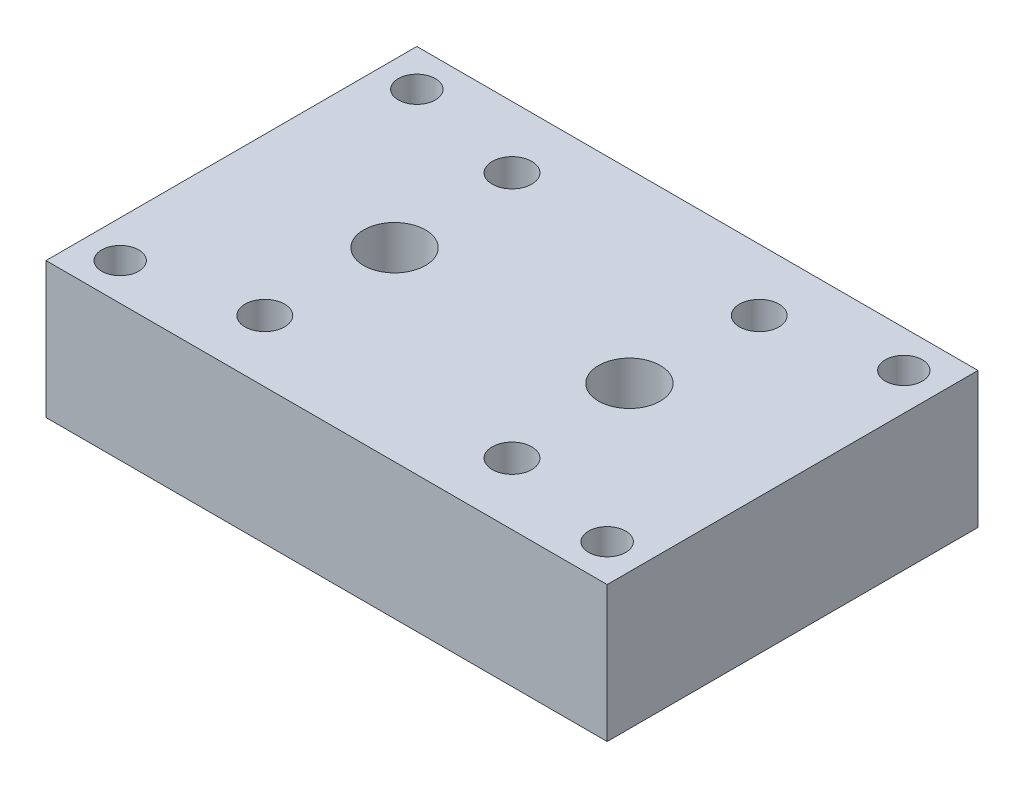
ISO-10303-21;
HEADER;
FILE_DESCRIPTION(('STEP AP214'),'2;1');
FILE_NAME('part.step','',(''),(''),'','','');
FILE_SCHEMA(('AUTOMOTIVE_DESIGN { 1 0 10303 214 1 1 1 1 }'));
ENDSEC;
DATA;
#1=APPLICATION_CONTEXT('core data for automotive mechanical design processes');
#2=APPLICATION_PROTOCOL_DEFINITION('international standard','automotive_design',2000,#1);
#3=PRODUCT_CONTEXT('',#1,'mechanical');
#4=PRODUCT('Part','Part','',(#3));
#5=PRODUCT_RELATED_PRODUCT_CATEGORY('part','',(#4));
#6=PRODUCT_DEFINITION_FORMATION('','',#4);
#7=PRODUCT_DEFINITION_CONTEXT('part definition',#1,'design');
#8=PRODUCT_DEFINITION('design','',#6,#7);
#9=PRODUCT_DEFINITION_SHAPE('','',#8);
#10=(LENGTH_UNIT() NAMED_UNIT(*) SI_UNIT(.MILLI.,.METRE.));
#11=(NAMED_UNIT(*) PLANE_ANGLE_UNIT() SI_UNIT($,.RADIAN.));
#12=(NAMED_UNIT(*) SI_UNIT($,.STERADIAN.) SOLID_ANGLE_UNIT());
#13=UNCERTAINTY_MEASURE_WITH_UNIT(LENGTH_MEASURE(1.E-05),#10,'distance_accuracy_value','');
#14=(GEOMETRIC_REPRESENTATION_CONTEXT(3) GLOBAL_UNCERTAINTY_ASSIGNED_CONTEXT((#13)) GLOBAL_UNIT_ASSIGNED_CONTEXT((#10,
#11,#12)) REPRESENTATION_CONTEXT('',''));
#15=CARTESIAN_POINT('',(0.,0.,0.));
#16=DIRECTION('',(0.,0.,1.));
#17=DIRECTION('',(1.,0.,0.));
#18=AXIS2_PLACEMENT_3D('',#15,#16,#17);
#19=CARTESIAN_POINT('',(22.7,11.,15.));
#20=DIRECTION('',(-1.,0.,0.));
#21=DIRECTION('',(0.,0.,1.));
#22=AXIS2_PLACEMENT_3D('',#19,#20,#21);
#23=PLANE('',#22);
#24=DIRECTION('',(0.,0.,-1.));
#25=VECTOR('',#24,1.);
#26=CARTESIAN_POINT('',(22.7,0.,15.));
#27=LINE('',#26,#25);
#28=CARTESIAN_POINT('',(22.7,0.,15.));
#29=VERTEX_POINT('',#28);
#30=CARTESIAN_POINT('',(22.7,0.,-15.));
#31=VERTEX_POINT('',#30);
#32=EDGE_CURVE('E108',#29,#31,#27,.T.);
#33=ORIENTED_EDGE('',*,*,#32,.T.);
#34=DIRECTION('',(0.,-1.,0.));
#35=VECTOR('',#34,1.);
#36=CARTESIAN_POINT('',(22.7,11.,-15.));
#37=LINE('',#36,#35);
#38=CARTESIAN_POINT('',(22.7,11.,-15.));
#39=VERTEX_POINT('',#38);
#40=EDGE_CURVE('E45',#39,#31,#37,.T.);
#41=ORIENTED_EDGE('',*,*,#40,.F.);
#42=DIRECTION('',(0.,0.,-1.));
#43=VECTOR('',#42,1.);
#44=CARTESIAN_POINT('',(22.7,11.,15.));
#45=LINE('',#44,#43);
#46=CARTESIAN_POINT('',(22.7,11.,15.));
#47=VERTEX_POINT('',#46);
#48=EDGE_CURVE('E95',#47,#39,#45,.T.);
#49=ORIENTED_EDGE('',*,*,#48,.F.);
#50=DIRECTION('',(0.,-1.,0.));
#51=VECTOR('',#50,1.);
#52=CARTESIAN_POINT('',(22.7,11.,15.));
#53=LINE('',#52,#51);
#54=EDGE_CURVE('E104',#47,#29,#53,.T.);
#55=ORIENTED_EDGE('',*,*,#54,.T.);
#56=EDGE_LOOP('',(#33,#41,#49,#55));
#57=FACE_BOUND('',#56,.T.);
#58=ADVANCED_FACE('F42',(#57),#23,.F.);
#59=CARTESIAN_POINT('',(-22.7,11.,-15.));
#60=DIRECTION('',(0.,0.,1.));
#61=DIRECTION('',(1.,0.,0.));
#62=AXIS2_PLACEMENT_3D('',#59,#60,#61);
#63=PLANE('',#62);
#64=DIRECTION('',(-1.,0.,0.));
#65=VECTOR('',#64,1.);
#66=CARTESIAN_POINT('',(-22.7,0.,-15.));
#67=LINE('',#66,#65);
#68=CARTESIAN_POINT('',(-22.7,0.,-15.));
#69=VERTEX_POINT('',#68);
#70=EDGE_CURVE('E100',#31,#69,#67,.T.);
#71=ORIENTED_EDGE('',*,*,#70,.T.);
#72=DIRECTION('',(0.,-1.,0.));
#73=VECTOR('',#72,1.);
#74=CARTESIAN_POINT('',(-22.7,11.,-15.));
#75=LINE('',#74,#73);
#76=CARTESIAN_POINT('',(-22.7,11.,-15.));
#77=VERTEX_POINT('',#76);
#78=EDGE_CURVE('E98',#77,#69,#75,.T.);
#79=ORIENTED_EDGE('',*,*,#78,.F.);
#80=DIRECTION('',(-1.,0.,0.));
#81=VECTOR('',#80,1.);
#82=CARTESIAN_POINT('',(-22.7,11.,-15.));
#83=LINE('',#82,#81);
#84=EDGE_CURVE('E90',#39,#77,#83,.T.);
#85=ORIENTED_EDGE('',*,*,#84,.F.);
#86=ORIENTED_EDGE('',*,*,#40,.T.);
#87=EDGE_LOOP('',(#71,#79,#85,#86));
#88=FACE_BOUND('',#87,.T.);
#89=ADVANCED_FACE('F99',(#88),#63,.F.);
#90=CARTESIAN_POINT('',(-22.7,11.,15.));
#91=DIRECTION('',(1.,0.,0.));
#92=DIRECTION('',(0.,0.,-1.));
#93=AXIS2_PLACEMENT_3D('',#90,#91,#92);
#94=PLANE('',#93);
#95=DIRECTION('',(0.,0.,1.));
#96=VECTOR('',#95,1.);
#97=CARTESIAN_POINT('',(-22.7,0.,15.));
#98=LINE('',#97,#96);
#99=CARTESIAN_POINT('',(-22.7,0.,15.));
#100=VERTEX_POINT('',#99);
#101=EDGE_CURVE('E76',#69,#100,#98,.T.);
#102=ORIENTED_EDGE('',*,*,#101,.T.);
#103=DIRECTION('',(0.,-1.,0.));
#104=VECTOR('',#103,1.);
#105=CARTESIAN_POINT('',(-22.7,11.,15.));
#106=LINE('',#105,#104);
#107=CARTESIAN_POINT('',(-22.7,11.,15.));
#108=VERTEX_POINT('',#107);
#109=EDGE_CURVE('E101',#108,#100,#106,.T.);
#110=ORIENTED_EDGE('',*,*,#109,.F.);
#111=DIRECTION('',(0.,0.,1.));
#112=VECTOR('',#111,1.);
#113=CARTESIAN_POINT('',(-22.7,11.,15.));
#114=LINE('',#113,#112);
#115=EDGE_CURVE('E93',#77,#108,#114,.T.);
#116=ORIENTED_EDGE('',*,*,#115,.F.);
#117=ORIENTED_EDGE('',*,*,#78,.T.);
#118=EDGE_LOOP('',(#102,#110,#116,#117));
#119=FACE_BOUND('',#118,.T.);
#120=ADVANCED_FACE('F102',(#119),#94,.F.);
#121=CARTESIAN_POINT('',(-22.7,11.,15.));
#122=DIRECTION('',(0.,0.,-1.));
#123=DIRECTION('',(-1.,0.,0.));
#124=AXIS2_PLACEMENT_3D('',#121,#122,#123);
#125=PLANE('',#124);
#126=DIRECTION('',(1.,0.,0.));
#127=VECTOR('',#126,1.);
#128=CARTESIAN_POINT('',(-22.7,0.,15.));
#129=LINE('',#128,#127);
#130=EDGE_CURVE('E82',#100,#29,#129,.T.);
#131=ORIENTED_EDGE('',*,*,#130,.T.);
#132=ORIENTED_EDGE('',*,*,#54,.F.);
#133=DIRECTION('',(1.,0.,0.));
#134=VECTOR('',#133,1.);
#135=CARTESIAN_POINT('',(-22.7,11.,15.));
#136=LINE('',#135,#134);
#137=EDGE_CURVE('E59',#108,#47,#136,.T.);
#138=ORIENTED_EDGE('',*,*,#137,.F.);
#139=ORIENTED_EDGE('',*,*,#109,.T.);
#140=EDGE_LOOP('',(#131,#132,#138,#139));
#141=FACE_BOUND('',#140,.T.);
#142=ADVANCED_FACE('F116',(#141),#125,.F.);
#143=CARTESIAN_POINT('',(0.,11.,0.));
#144=DIRECTION('',(0.,-1.,0.));
#145=DIRECTION('',(0.,0.,-1.));
#146=AXIS2_PLACEMENT_3D('',#143,#144,#145);
#147=PLANE('',#146);
#148=CARTESIAN_POINT('',(-19.7,11.,12.));
#149=DIRECTION('',(0.,1.,0.));
#150=DIRECTION('',(0.,0.,1.));
#151=AXIS2_PLACEMENT_3D('',#148,#149,#150);
#152=CIRCLE('',#151,1.5);
#153=CARTESIAN_POINT('',(-19.7,11.,13.5));
#154=VERTEX_POINT('',#153);
#155=EDGE_CURVE('E176',#154,#154,#152,.T.);
#156=ORIENTED_EDGE('',*,*,#155,.F.);
#157=EDGE_LOOP('',(#156));
#158=FACE_BOUND('',#157,.T.);
#159=CARTESIAN_POINT('',(19.7,11.,12.));
#160=DIRECTION('',(0.,1.,0.));
#161=DIRECTION('',(0.,0.,1.));
#162=AXIS2_PLACEMENT_3D('',#159,#160,#161);
#163=CIRCLE('',#162,1.5);
#164=CARTESIAN_POINT('',(19.7,11.,13.5));
#165=VERTEX_POINT('',#164);
#166=EDGE_CURVE('E182',#165,#165,#163,.T.);
#167=ORIENTED_EDGE('',*,*,#166,.F.);
#168=EDGE_LOOP('',(#167));
#169=FACE_BOUND('',#168,.T.);
#170=CARTESIAN_POINT('',(19.7,11.,-12.));
#171=DIRECTION('',(0.,1.,0.));
#172=DIRECTION('',(0.,0.,1.));
#173=AXIS2_PLACEMENT_3D('',#170,#171,#172);
#174=CIRCLE('',#173,1.5);
#175=CARTESIAN_POINT('',(19.7,11.,-10.5));
#176=VERTEX_POINT('',#175);
#177=EDGE_CURVE('E170',#176,#176,#174,.T.);
#178=ORIENTED_EDGE('',*,*,#177,.F.);
#179=EDGE_LOOP('',(#178));
#180=FACE_BOUND('',#179,.T.);
#181=CARTESIAN_POINT('',(-19.7,11.,-12.));
#182=DIRECTION('',(0.,1.,0.));
#183=DIRECTION('',(0.,0.,1.));
#184=AXIS2_PLACEMENT_3D('',#181,#182,#183);
#185=CIRCLE('',#184,1.5);
#186=CARTESIAN_POINT('',(-19.7,11.,-10.5));
#187=VERTEX_POINT('',#186);
#188=EDGE_CURVE('E167',#187,#187,#185,.T.);
#189=ORIENTED_EDGE('',*,*,#188,.F.);
#190=EDGE_LOOP('',(#189));
#191=FACE_BOUND('',#190,.T.);
#192=CARTESIAN_POINT('',(-9.99999999999999,11.,-10.));
#193=DIRECTION('',(0.,1.,0.));
#194=DIRECTION('',(0.,0.,1.));
#195=AXIS2_PLACEMENT_3D('',#192,#193,#194);
#196=CIRCLE('',#195,1.6);
#197=CARTESIAN_POINT('',(-9.99999999999999,11.,-8.4));
#198=VERTEX_POINT('',#197);
#199=EDGE_CURVE('E154',#198,#198,#196,.T.);
#200=ORIENTED_EDGE('',*,*,#199,.F.);
#201=EDGE_LOOP('',(#200));
#202=FACE_BOUND('',#201,.T.);
#203=CARTESIAN_POINT('',(10.,11.,-10.));
#204=DIRECTION('',(0.,1.,0.));
#205=DIRECTION('',(0.,0.,1.));
#206=AXIS2_PLACEMENT_3D('',#203,#204,#205);
#207=CIRCLE('',#206,1.6);
#208=CARTESIAN_POINT('',(10.,11.,-8.4));
#209=VERTEX_POINT('',#208);
#210=EDGE_CURVE('E148',#209,#209,#207,.T.);
#211=ORIENTED_EDGE('',*,*,#210,.F.);
#212=EDGE_LOOP('',(#211));
#213=FACE_BOUND('',#212,.T.);
#214=CARTESIAN_POINT('',(10.0000000000002,11.,10.));
#215=DIRECTION('',(0.,1.,0.));
#216=DIRECTION('',(0.,0.,1.));
#217=AXIS2_PLACEMENT_3D('',#214,#215,#216);
#218=CIRCLE('',#217,1.6);
#219=CARTESIAN_POINT('',(10.0000000000002,11.,11.6));
#220=VERTEX_POINT('',#219);
#221=EDGE_CURVE('E142',#220,#220,#218,.T.);
#222=ORIENTED_EDGE('',*,*,#221,.F.);
#223=EDGE_LOOP('',(#222));
#224=FACE_BOUND('',#223,.T.);
#225=CARTESIAN_POINT('',(-9.99999999999979,11.,10.));
#226=DIRECTION('',(0.,1.,0.));
#227=DIRECTION('',(0.,0.,1.));
#228=AXIS2_PLACEMENT_3D('',#225,#226,#227);
#229=CIRCLE('',#228,1.6);
#230=CARTESIAN_POINT('',(-9.99999999999979,11.,11.6));
#231=VERTEX_POINT('',#230);
#232=EDGE_CURVE('E136',#231,#231,#229,.T.);
#233=ORIENTED_EDGE('',*,*,#232,.F.);
#234=EDGE_LOOP('',(#233));
#235=FACE_BOUND('',#234,.T.);
#236=CARTESIAN_POINT('',(-9.49999999999999,11.,0.));
#237=DIRECTION('',(0.,1.,0.));
#238=DIRECTION('',(0.,0.,1.));
#239=AXIS2_PLACEMENT_3D('',#236,#237,#238);
#240=CIRCLE('',#239,2.5);
#241=CARTESIAN_POINT('',(-9.49999999999999,11.,2.5));
#242=VERTEX_POINT('',#241);
#243=EDGE_CURVE('E129',#242,#242,#240,.T.);
#244=ORIENTED_EDGE('',*,*,#243,.F.);
#245=EDGE_LOOP('',(#244));
#246=FACE_BOUND('',#245,.T.);
#247=CARTESIAN_POINT('',(9.5,11.,0.));
#248=DIRECTION('',(0.,1.,0.));
#249=DIRECTION('',(0.,0.,1.));
#250=AXIS2_PLACEMENT_3D('',#247,#248,#249);
#251=CIRCLE('',#250,2.5);
#252=CARTESIAN_POINT('',(9.5,11.,2.5));
#253=VERTEX_POINT('',#252);
#254=EDGE_CURVE('E125',#253,#253,#251,.T.);
#255=ORIENTED_EDGE('',*,*,#254,.F.);
#256=EDGE_LOOP('',(#255));
#257=FACE_BOUND('',#256,.T.);
#258=ORIENTED_EDGE('',*,*,#48,.T.);
#259=ORIENTED_EDGE('',*,*,#84,.T.);
#260=ORIENTED_EDGE('',*,*,#115,.T.);
#261=ORIENTED_EDGE('',*,*,#137,.T.);
#262=EDGE_LOOP('',(#258,#259,#260,#261));
#263=FACE_BOUND('',#262,.T.);
#264=ADVANCED_FACE('F91',(#158,#169,#180,#191,#202,#213,#224,#235,#246,#257,#263),#147,.F.);
#265=CARTESIAN_POINT('',(0.,0.,0.));
#266=DIRECTION('',(0.,-1.,0.));
#267=DIRECTION('',(0.,0.,-1.));
#268=AXIS2_PLACEMENT_3D('',#265,#266,#267);
#269=PLANE('',#268);
#270=CARTESIAN_POINT('',(0.,0.,-5.));
#271=DIRECTION('',(0.,-1.,0.));
#272=DIRECTION('',(0.,0.,-1.));
#273=AXIS2_PLACEMENT_3D('',#270,#271,#272);
#274=CIRCLE('',#273,3.);
#275=CARTESIAN_POINT('',(0.,0.,-8.));
#276=VERTEX_POINT('',#275);
#277=EDGE_CURVE('E158',#276,#276,#274,.T.);
#278=ORIENTED_EDGE('',*,*,#277,.F.);
#279=EDGE_LOOP('',(#278));
#280=FACE_BOUND('',#279,.T.);
#281=CARTESIAN_POINT('',(-9.99999999999999,0.,-10.));
#282=DIRECTION('',(0.,1.,0.));
#283=DIRECTION('',(0.,0.,1.));
#284=AXIS2_PLACEMENT_3D('',#281,#282,#283);
#285=CIRCLE('',#284,1.6);
#286=CARTESIAN_POINT('',(-9.99999999999999,0.,-8.4));
#287=VERTEX_POINT('',#286);
#288=EDGE_CURVE('E151',#287,#287,#285,.T.);
#289=ORIENTED_EDGE('',*,*,#288,.T.);
#290=EDGE_LOOP('',(#289));
#291=FACE_BOUND('',#290,.T.);
#292=CARTESIAN_POINT('',(10.,0.,-10.));
#293=DIRECTION('',(0.,1.,0.));
#294=DIRECTION('',(0.,0.,1.));
#295=AXIS2_PLACEMENT_3D('',#292,#293,#294);
#296=CIRCLE('',#295,1.6);
#297=CARTESIAN_POINT('',(10.,0.,-8.4));
#298=VERTEX_POINT('',#297);
#299=EDGE_CURVE('E145',#298,#298,#296,.T.);
#300=ORIENTED_EDGE('',*,*,#299,.T.);
#301=EDGE_LOOP('',(#300));
#302=FACE_BOUND('',#301,.T.);
#303=CARTESIAN_POINT('',(10.0000000000002,0.,10.));
#304=DIRECTION('',(0.,1.,0.));
#305=DIRECTION('',(0.,0.,1.));
#306=AXIS2_PLACEMENT_3D('',#303,#304,#305);
#307=CIRCLE('',#306,1.6);
#308=CARTESIAN_POINT('',(10.0000000000002,0.,11.6));
#309=VERTEX_POINT('',#308);
#310=EDGE_CURVE('E139',#309,#309,#307,.T.);
#311=ORIENTED_EDGE('',*,*,#310,.T.);
#312=EDGE_LOOP('',(#311));
#313=FACE_BOUND('',#312,.T.);
#314=CARTESIAN_POINT('',(-9.99999999999979,0.,10.));
#315=DIRECTION('',(0.,1.,0.));
#316=DIRECTION('',(0.,0.,1.));
#317=AXIS2_PLACEMENT_3D('',#314,#315,#316);
#318=CIRCLE('',#317,1.6);
#319=CARTESIAN_POINT('',(-9.99999999999979,0.,11.6));
#320=VERTEX_POINT('',#319);
#321=EDGE_CURVE('E126',#320,#320,#318,.T.);
#322=ORIENTED_EDGE('',*,*,#321,.T.);
#323=EDGE_LOOP('',(#322));
#324=FACE_BOUND('',#323,.T.);
#325=CARTESIAN_POINT('',(-9.49999999999999,0.,0.));
#326=DIRECTION('',(0.,1.,0.));
#327=DIRECTION('',(0.,0.,1.));
#328=AXIS2_PLACEMENT_3D('',#325,#326,#327);
#329=CIRCLE('',#328,2.5);
#330=CARTESIAN_POINT('',(-9.49999999999999,0.,2.5));
#331=VERTEX_POINT('',#330);
#332=EDGE_CURVE('E111',#331,#331,#329,.T.);
#333=ORIENTED_EDGE('',*,*,#332,.T.);
#334=EDGE_LOOP('',(#333));
#335=FACE_BOUND('',#334,.T.);
#336=CARTESIAN_POINT('',(9.5,0.,0.));
#337=DIRECTION('',(0.,1.,0.));
#338=DIRECTION('',(0.,0.,1.));
#339=AXIS2_PLACEMENT_3D('',#336,#337,#338);
#340=CIRCLE('',#339,2.5);
#341=CARTESIAN_POINT('',(9.5,0.,2.5));
#342=VERTEX_POINT('',#341);
#343=EDGE_CURVE('E122',#342,#342,#340,.T.);
#344=ORIENTED_EDGE('',*,*,#343,.T.);
#345=EDGE_LOOP('',(#344));
#346=FACE_BOUND('',#345,.T.);
#347=ORIENTED_EDGE('',*,*,#32,.F.);
#348=ORIENTED_EDGE('',*,*,#130,.F.);
#349=ORIENTED_EDGE('',*,*,#101,.F.);
#350=ORIENTED_EDGE('',*,*,#70,.F.);
#351=EDGE_LOOP('',(#347,#348,#349,#350));
#352=FACE_BOUND('',#351,.T.);
#353=ADVANCED_FACE('F119',(#280,#291,#302,#313,#324,#335,#346,#352),#269,.T.);
#354=CARTESIAN_POINT('',(9.5,0.,0.));
#355=DIRECTION('',(0.,1.,0.));
#356=DIRECTION('',(0.,0.,1.));
#357=AXIS2_PLACEMENT_3D('',#354,#355,#356);
#358=CYLINDRICAL_SURFACE('',#357,2.5);
#359=ORIENTED_EDGE('',*,*,#343,.F.);
#360=EDGE_LOOP('',(#359));
#361=FACE_BOUND('',#360,.T.);
#362=ORIENTED_EDGE('',*,*,#254,.T.);
#363=EDGE_LOOP('',(#362));
#364=FACE_BOUND('',#363,.T.);
#365=ADVANCED_FACE('F211',(#361,#364),#358,.F.);
#366=CARTESIAN_POINT('',(-9.49999999999999,0.,0.));
#367=DIRECTION('',(0.,1.,0.));
#368=DIRECTION('',(0.,0.,1.));
#369=AXIS2_PLACEMENT_3D('',#366,#367,#368);
#370=CYLINDRICAL_SURFACE('',#369,2.5);
#371=ORIENTED_EDGE('',*,*,#332,.F.);
#372=EDGE_LOOP('',(#371));
#373=FACE_BOUND('',#372,.T.);
#374=ORIENTED_EDGE('',*,*,#243,.T.);
#375=EDGE_LOOP('',(#374));
#376=FACE_BOUND('',#375,.T.);
#377=ADVANCED_FACE('F213',(#373,#376),#370,.F.);
#378=CARTESIAN_POINT('',(-9.99999999999979,11.,10.));
#379=DIRECTION('',(0.,1.,0.));
#380=DIRECTION('',(0.,0.,1.));
#381=AXIS2_PLACEMENT_3D('',#378,#379,#380);
#382=CYLINDRICAL_SURFACE('',#381,1.6);
#383=ORIENTED_EDGE('',*,*,#321,.F.);
#384=EDGE_LOOP('',(#383));
#385=FACE_BOUND('',#384,.T.);
#386=ORIENTED_EDGE('',*,*,#232,.T.);
#387=EDGE_LOOP('',(#386));
#388=FACE_BOUND('',#387,.T.);
#389=ADVANCED_FACE('F220',(#385,#388),#382,.F.);
#390=CARTESIAN_POINT('',(10.0000000000002,11.,10.));
#391=DIRECTION('',(0.,1.,0.));
#392=DIRECTION('',(0.,0.,1.));
#393=AXIS2_PLACEMENT_3D('',#390,#391,#392);
#394=CYLINDRICAL_SURFACE('',#393,1.6);
#395=ORIENTED_EDGE('',*,*,#310,.F.);
#396=EDGE_LOOP('',(#395));
#397=FACE_BOUND('',#396,.T.);
#398=ORIENTED_EDGE('',*,*,#221,.T.);
#399=EDGE_LOOP('',(#398));
#400=FACE_BOUND('',#399,.T.);
#401=ADVANCED_FACE('F415',(#397,#400),#394,.F.);
#402=CARTESIAN_POINT('',(10.,11.,-10.));
#403=DIRECTION('',(0.,1.,0.));
#404=DIRECTION('',(0.,0.,1.));
#405=AXIS2_PLACEMENT_3D('',#402,#403,#404);
#406=CYLINDRICAL_SURFACE('',#405,1.6);
#407=ORIENTED_EDGE('',*,*,#299,.F.);
#408=EDGE_LOOP('',(#407));
#409=FACE_BOUND('',#408,.T.);
#410=ORIENTED_EDGE('',*,*,#210,.T.);
#411=EDGE_LOOP('',(#410));
#412=FACE_BOUND('',#411,.T.);
#413=ADVANCED_FACE('F406',(#409,#412),#406,.F.);
#414=CARTESIAN_POINT('',(-9.99999999999999,11.,-10.));
#415=DIRECTION('',(0.,1.,0.));
#416=DIRECTION('',(0.,0.,1.));
#417=AXIS2_PLACEMENT_3D('',#414,#415,#416);
#418=CYLINDRICAL_SURFACE('',#417,1.6);
#419=ORIENTED_EDGE('',*,*,#288,.F.);
#420=EDGE_LOOP('',(#419));
#421=FACE_BOUND('',#420,.T.);
#422=ORIENTED_EDGE('',*,*,#199,.T.);
#423=EDGE_LOOP('',(#422));
#424=FACE_BOUND('',#423,.T.);
#425=ADVANCED_FACE('F258',(#421,#424),#418,.F.);
#426=CARTESIAN_POINT('',(0.,-4.5,-5.));
#427=DIRECTION('',(0.,1.,0.));
#428=DIRECTION('',(0.,0.,1.));
#429=AXIS2_PLACEMENT_3D('',#426,#427,#428);
#430=CYLINDRICAL_SURFACE('',#429,3.);
#431=CARTESIAN_POINT('',(0.,-4.5,-5.));
#432=DIRECTION('',(0.,-1.,0.));
#433=DIRECTION('',(0.,0.,-1.));
#434=AXIS2_PLACEMENT_3D('',#431,#432,#433);
#435=CIRCLE('',#434,3.);
#436=CARTESIAN_POINT('',(0.,-4.5,-8.));
#437=VERTEX_POINT('',#436);
#438=EDGE_CURVE('E157',#437,#437,#435,.T.);
#439=ORIENTED_EDGE('',*,*,#438,.F.);
#440=EDGE_LOOP('',(#439));
#441=FACE_BOUND('',#440,.T.);
#442=ORIENTED_EDGE('',*,*,#277,.T.);
#443=EDGE_LOOP('',(#442));
#444=FACE_BOUND('',#443,.T.);
#445=ADVANCED_FACE('F263',(#441,#444),#430,.T.);
#446=CARTESIAN_POINT('',(0.,-4.5,-5.));
#447=DIRECTION('',(0.,-1.,0.));
#448=DIRECTION('',(0.,0.,-1.));
#449=AXIS2_PLACEMENT_3D('',#446,#447,#448);
#450=PLANE('',#449);
#451=CARTESIAN_POINT('',(0.,-4.5,-5.));
#452=DIRECTION('',(0.,-1.,0.));
#453=DIRECTION('',(0.,0.,-1.));
#454=AXIS2_PLACEMENT_3D('',#451,#452,#453);
#455=CIRCLE('',#454,1.75);
#456=CARTESIAN_POINT('',(0.,-4.5,-6.75));
#457=VERTEX_POINT('',#456);
#458=EDGE_CURVE('E11',#457,#457,#455,.T.);
#459=ORIENTED_EDGE('',*,*,#458,.F.);
#460=EDGE_LOOP('',(#459));
#461=FACE_BOUND('',#460,.T.);
#462=ORIENTED_EDGE('',*,*,#438,.T.);
#463=EDGE_LOOP('',(#462));
#464=FACE_BOUND('',#463,.T.);
#465=ADVANCED_FACE('F268',(#461,#464),#450,.T.);
#466=CARTESIAN_POINT('',(0.,-7.5,-5.));
#467=DIRECTION('',(0.,1.,0.));
#468=DIRECTION('',(0.,0.,1.));
#469=AXIS2_PLACEMENT_3D('',#466,#467,#468);
#470=CYLINDRICAL_SURFACE('',#469,1.75);
#471=CARTESIAN_POINT('',(0.,-7.5,-5.));
#472=DIRECTION('',(0.,-1.,0.));
#473=DIRECTION('',(0.,0.,-1.));
#474=AXIS2_PLACEMENT_3D('',#471,#472,#473);
#475=CIRCLE('',#474,1.75);
#476=CARTESIAN_POINT('',(0.,-7.5,-6.75));
#477=VERTEX_POINT('',#476);
#478=EDGE_CURVE('E161',#477,#477,#475,.T.);
#479=ORIENTED_EDGE('',*,*,#478,.F.);
#480=EDGE_LOOP('',(#479));
#481=FACE_BOUND('',#480,.T.);
#482=ORIENTED_EDGE('',*,*,#458,.T.);
#483=EDGE_LOOP('',(#482));
#484=FACE_BOUND('',#483,.T.);
#485=ADVANCED_FACE('F279',(#481,#484),#470,.T.);
#486=CARTESIAN_POINT('',(0.,-7.5,-5.));
#487=DIRECTION('',(0.,-1.,0.));
#488=DIRECTION('',(0.,0.,-1.));
#489=AXIS2_PLACEMENT_3D('',#486,#487,#488);
#490=PLANE('',#489);
#491=ORIENTED_EDGE('',*,*,#478,.T.);
#492=EDGE_LOOP('',(#491));
#493=FACE_BOUND('',#492,.T.);
#494=ADVANCED_FACE('F289',(#493),#490,.T.);
#495=CARTESIAN_POINT('',(-19.7,7.,-12.));
#496=DIRECTION('',(0.,1.,0.));
#497=DIRECTION('',(0.,0.,1.));
#498=AXIS2_PLACEMENT_3D('',#495,#496,#497);
#499=CYLINDRICAL_SURFACE('',#498,1.5);
#500=CARTESIAN_POINT('',(-19.7,7.,-12.));
#501=DIRECTION('',(0.,1.,0.));
#502=DIRECTION('',(0.,0.,1.));
#503=AXIS2_PLACEMENT_3D('',#500,#501,#502);
#504=CIRCLE('',#503,1.5);
#505=CARTESIAN_POINT('',(-19.7,7.,-10.5));
#506=VERTEX_POINT('',#505);
#507=EDGE_CURVE('E166',#506,#506,#504,.T.);
#508=ORIENTED_EDGE('',*,*,#507,.F.);
#509=EDGE_LOOP('',(#508));
#510=FACE_BOUND('',#509,.T.);
#511=ORIENTED_EDGE('',*,*,#188,.T.);
#512=EDGE_LOOP('',(#511));
#513=FACE_BOUND('',#512,.T.);
#514=ADVANCED_FACE('F299',(#510,#513),#499,.F.);
#515=CARTESIAN_POINT('',(-19.7,7.,-12.));
#516=DIRECTION('',(0.,1.,0.));
#517=DIRECTION('',(0.,0.,1.));
#518=AXIS2_PLACEMENT_3D('',#515,#516,#517);
#519=PLANE('',#518);
#520=ORIENTED_EDGE('',*,*,#507,.T.);
#521=EDGE_LOOP('',(#520));
#522=FACE_BOUND('',#521,.T.);
#523=ADVANCED_FACE('F310',(#522),#519,.T.);
#524=CARTESIAN_POINT('',(19.7,7.,-12.));
#525=DIRECTION('',(0.,1.,0.));
#526=DIRECTION('',(0.,0.,1.));
#527=AXIS2_PLACEMENT_3D('',#524,#525,#526);
#528=CYLINDRICAL_SURFACE('',#527,1.5);
#529=CARTESIAN_POINT('',(19.7,7.,-12.));
#530=DIRECTION('',(0.,1.,0.));
#531=DIRECTION('',(0.,0.,1.));
#532=AXIS2_PLACEMENT_3D('',#529,#530,#531);
#533=CIRCLE('',#532,1.5);
#534=CARTESIAN_POINT('',(19.7,7.,-10.5));
#535=VERTEX_POINT('',#534);
#536=EDGE_CURVE('E185',#535,#535,#533,.T.);
#537=ORIENTED_EDGE('',*,*,#536,.F.);
#538=EDGE_LOOP('',(#537));
#539=FACE_BOUND('',#538,.T.);
#540=ORIENTED_EDGE('',*,*,#177,.T.);
#541=EDGE_LOOP('',(#540));
#542=FACE_BOUND('',#541,.T.);
#543=ADVANCED_FACE('F191',(#539,#542),#528,.F.);
#544=CARTESIAN_POINT('',(19.7,7.,-12.));
#545=DIRECTION('',(0.,1.,0.));
#546=DIRECTION('',(0.,0.,1.));
#547=AXIS2_PLACEMENT_3D('',#544,#545,#546);
#548=PLANE('',#547);
#549=ORIENTED_EDGE('',*,*,#536,.T.);
#550=EDGE_LOOP('',(#549));
#551=FACE_BOUND('',#550,.T.);
#552=ADVANCED_FACE('F324',(#551),#548,.T.);
#553=CARTESIAN_POINT('',(19.7,7.,12.));
#554=DIRECTION('',(0.,1.,0.));
#555=DIRECTION('',(0.,0.,1.));
#556=AXIS2_PLACEMENT_3D('',#553,#554,#555);
#557=CYLINDRICAL_SURFACE('',#556,1.5);
#558=CARTESIAN_POINT('',(19.7,7.,12.));
#559=DIRECTION('',(0.,1.,0.));
#560=DIRECTION('',(0.,0.,1.));
#561=AXIS2_PLACEMENT_3D('',#558,#559,#560);
#562=CIRCLE('',#561,1.5);
#563=CARTESIAN_POINT('',(19.7,7.,13.5));
#564=VERTEX_POINT('',#563);
#565=EDGE_CURVE('E179',#564,#564,#562,.T.);
#566=ORIENTED_EDGE('',*,*,#565,.F.);
#567=EDGE_LOOP('',(#566));
#568=FACE_BOUND('',#567,.T.);
#569=ORIENTED_EDGE('',*,*,#166,.T.);
#570=EDGE_LOOP('',(#569));
#571=FACE_BOUND('',#570,.T.);
#572=ADVANCED_FACE('F332',(#568,#571),#557,.F.);
#573=CARTESIAN_POINT('',(19.7,7.,12.));
#574=DIRECTION('',(0.,1.,0.));
#575=DIRECTION('',(0.,0.,1.));
#576=AXIS2_PLACEMENT_3D('',#573,#574,#575);
#577=PLANE('',#576);
#578=ORIENTED_EDGE('',*,*,#565,.T.);
#579=EDGE_LOOP('',(#578));
#580=FACE_BOUND('',#579,.T.);
#581=ADVANCED_FACE('F340',(#580),#577,.T.);
#582=CARTESIAN_POINT('',(-19.7,7.,12.));
#583=DIRECTION('',(0.,1.,0.));
#584=DIRECTION('',(0.,0.,1.));
#585=AXIS2_PLACEMENT_3D('',#582,#583,#584);
#586=CYLINDRICAL_SURFACE('',#585,1.5);
#587=CARTESIAN_POINT('',(-19.7,7.,12.));
#588=DIRECTION('',(0.,1.,0.));
#589=DIRECTION('',(0.,0.,1.));
#590=AXIS2_PLACEMENT_3D('',#587,#588,#589);
#591=CIRCLE('',#590,1.5);
#592=CARTESIAN_POINT('',(-19.7,7.,13.5));
#593=VERTEX_POINT('',#592);
#594=EDGE_CURVE('E173',#593,#593,#591,.T.);
#595=ORIENTED_EDGE('',*,*,#594,.F.);
#596=EDGE_LOOP('',(#595));
#597=FACE_BOUND('',#596,.T.);
#598=ORIENTED_EDGE('',*,*,#155,.T.);
#599=EDGE_LOOP('',(#598));
#600=FACE_BOUND('',#599,.T.);
#601=ADVANCED_FACE('F348',(#597,#600),#586,.F.);
#602=CARTESIAN_POINT('',(-19.7,7.,12.));
#603=DIRECTION('',(0.,1.,0.));
#604=DIRECTION('',(0.,0.,1.));
#605=AXIS2_PLACEMENT_3D('',#602,#603,#604);
#606=PLANE('',#605);
#607=ORIENTED_EDGE('',*,*,#594,.T.);
#608=EDGE_LOOP('',(#607));
#609=FACE_BOUND('',#608,.T.);
#610=ADVANCED_FACE('F356',(#609),#606,.T.);
#611=CLOSED_SHELL('',(#58,#89,#120,#142,#264,#353,#365,#377,#389,#401,#413,#425,#445,#465,#485,
#494,#514,#523,#543,#552,#572,#581,#601,#610));
#612=MANIFOLD_SOLID_BREP('B2',#611);
#613=ADVANCED_BREP_SHAPE_REPRESENTATION('',(#18,#612),#14);
#614=SHAPE_DEFINITION_REPRESENTATION(#9,#613);
ENDSEC;
END-ISO-10303-21;
